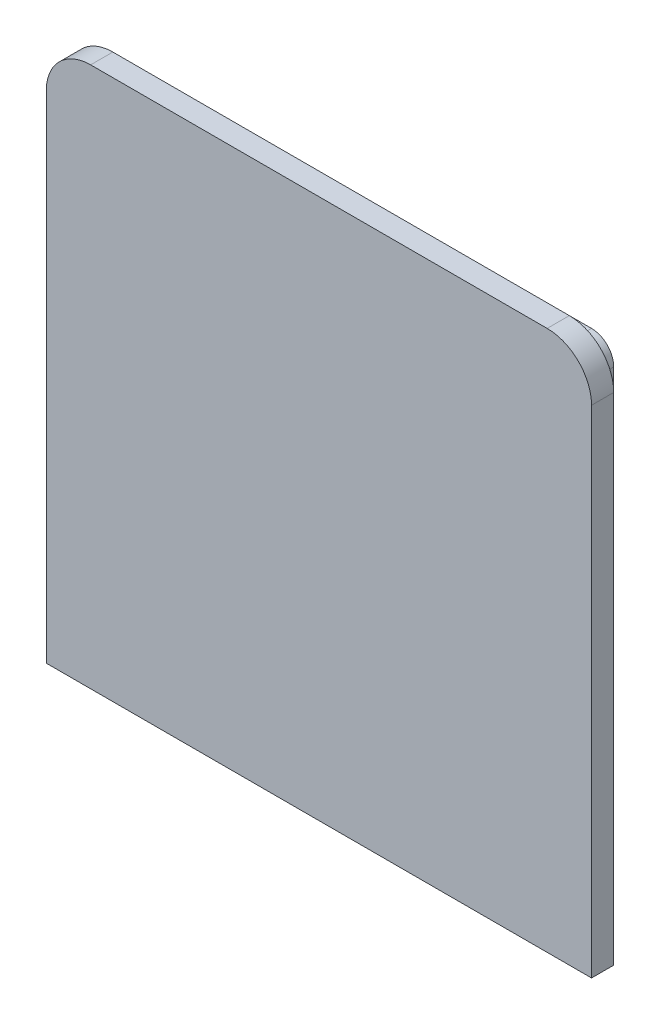
ISO-10303-21;
HEADER;
FILE_DESCRIPTION(('STEP AP214'),'2;1');
FILE_NAME('part.step','',(''),(''),'','','');
FILE_SCHEMA(('AUTOMOTIVE_DESIGN { 1 0 10303 214 1 1 1 1 }'));
ENDSEC;
DATA;
#1=APPLICATION_CONTEXT('core data for automotive mechanical design processes');
#2=APPLICATION_PROTOCOL_DEFINITION('international standard','automotive_design',2000,#1);
#3=PRODUCT_CONTEXT('',#1,'mechanical');
#4=PRODUCT('Part','Part','',(#3));
#5=PRODUCT_RELATED_PRODUCT_CATEGORY('part','',(#4));
#6=PRODUCT_DEFINITION_FORMATION('','',#4);
#7=PRODUCT_DEFINITION_CONTEXT('part definition',#1,'design');
#8=PRODUCT_DEFINITION('design','',#6,#7);
#9=PRODUCT_DEFINITION_SHAPE('','',#8);
#10=(LENGTH_UNIT() NAMED_UNIT(*) SI_UNIT(.MILLI.,.METRE.));
#11=(NAMED_UNIT(*) PLANE_ANGLE_UNIT() SI_UNIT($,.RADIAN.));
#12=(NAMED_UNIT(*) SI_UNIT($,.STERADIAN.) SOLID_ANGLE_UNIT());
#13=UNCERTAINTY_MEASURE_WITH_UNIT(LENGTH_MEASURE(1.E-05),#10,'distance_accuracy_value','');
#14=(GEOMETRIC_REPRESENTATION_CONTEXT(3) GLOBAL_UNCERTAINTY_ASSIGNED_CONTEXT((#13)) GLOBAL_UNIT_ASSIGNED_CONTEXT((#10,
#11,#12)) REPRESENTATION_CONTEXT('',''));
#15=CARTESIAN_POINT('',(0.,0.,0.));
#16=DIRECTION('',(0.,0.,1.));
#17=DIRECTION('',(1.,0.,0.));
#18=AXIS2_PLACEMENT_3D('',#15,#16,#17);
#19=CARTESIAN_POINT('',(17.8633729019827,80.3220364003978,-1.));
#20=DIRECTION('',(1.,0.,0.));
#21=DIRECTION('',(0.,0.,-1.));
#22=AXIS2_PLACEMENT_3D('',#19,#20,#21);
#23=PLANE('',#22);
#24=DIRECTION('',(0.,1.,0.));
#25=VECTOR('',#24,1.);
#26=CARTESIAN_POINT('',(17.8633729019827,80.3220364003978,0.));
#27=LINE('',#26,#25);
#28=CARTESIAN_POINT('',(17.8633729019827,80.3220364003978,0.));
#29=VERTEX_POINT('',#28);
#30=CARTESIAN_POINT('',(17.8633729019827,100.681701940786,0.));
#31=VERTEX_POINT('',#30);
#32=EDGE_CURVE('E265',#29,#31,#27,.T.);
#33=ORIENTED_EDGE('',*,*,#32,.F.);
#34=DIRECTION('',(0.,0.,1.));
#35=VECTOR('',#34,1.);
#36=CARTESIAN_POINT('',(17.8633729019827,80.3220364003978,-1.));
#37=LINE('',#36,#35);
#38=CARTESIAN_POINT('',(17.8633729019827,80.3220364003978,-1.));
#39=VERTEX_POINT('',#38);
#40=EDGE_CURVE('E12',#29,#39,#37,.F.);
#41=ORIENTED_EDGE('',*,*,#40,.T.);
#42=DIRECTION('',(0.,1.,0.));
#43=VECTOR('',#42,1.);
#44=CARTESIAN_POINT('',(17.8633729019827,80.3220364003978,-1.));
#45=LINE('',#44,#43);
#46=CARTESIAN_POINT('',(17.8633729019827,100.681701940786,-1.));
#47=VERTEX_POINT('',#46);
#48=EDGE_CURVE('E274',#39,#47,#45,.T.);
#49=ORIENTED_EDGE('',*,*,#48,.T.);
#50=DIRECTION('',(0.,0.,1.));
#51=VECTOR('',#50,1.);
#52=CARTESIAN_POINT('',(17.8633729019827,100.681701940786,-1.));
#53=LINE('',#52,#51);
#54=EDGE_CURVE('E89',#47,#31,#53,.T.);
#55=ORIENTED_EDGE('',*,*,#54,.T.);
#56=EDGE_LOOP('',(#33,#41,#49,#55));
#57=FACE_BOUND('',#56,.T.);
#58=ADVANCED_FACE('F81',(#57),#23,.T.);
#59=CARTESIAN_POINT('',(11.573708355002,79.3220364003978,-1.));
#60=DIRECTION('',(0.,-1.,0.));
#61=DIRECTION('',(0.,0.,-1.));
#62=AXIS2_PLACEMENT_3D('',#59,#60,#61);
#63=PLANE('',#62);
#64=DIRECTION('',(1.,0.,0.));
#65=VECTOR('',#64,1.);
#66=CARTESIAN_POINT('',(-3.71595619197894,79.3220364003978,-1.));
#67=LINE('',#66,#65);
#68=CARTESIAN_POINT('',(-3.71595619197894,79.3220364003978,-1.));
#69=VERTEX_POINT('',#68);
#70=CARTESIAN_POINT('',(16.8633729019827,79.3220364003978,-1.));
#71=VERTEX_POINT('',#70);
#72=EDGE_CURVE('E284',#69,#71,#67,.T.);
#73=ORIENTED_EDGE('',*,*,#72,.T.);
#74=DIRECTION('',(0.,0.,1.));
#75=VECTOR('',#74,1.);
#76=CARTESIAN_POINT('',(16.8633729019827,79.3220364003978,-1.));
#77=LINE('',#76,#75);
#78=CARTESIAN_POINT('',(16.8633729019827,79.3220364003978,0.));
#79=VERTEX_POINT('',#78);
#80=EDGE_CURVE('E326',#71,#79,#77,.T.);
#81=ORIENTED_EDGE('',*,*,#80,.T.);
#82=DIRECTION('',(1.,0.,0.));
#83=VECTOR('',#82,1.);
#84=CARTESIAN_POINT('',(11.573708355002,79.3220364003978,0.));
#85=LINE('',#84,#83);
#86=CARTESIAN_POINT('',(-3.71595619197894,79.3220364003978,0.));
#87=VERTEX_POINT('',#86);
#88=EDGE_CURVE('E278',#87,#79,#85,.T.);
#89=ORIENTED_EDGE('',*,*,#88,.F.);
#90=DIRECTION('',(0.,0.,1.));
#91=VECTOR('',#90,1.);
#92=CARTESIAN_POINT('',(-3.71595619197894,79.3220364003978,-1.));
#93=LINE('',#92,#91);
#94=EDGE_CURVE('E103',#87,#69,#93,.F.);
#95=ORIENTED_EDGE('',*,*,#94,.T.);
#96=EDGE_LOOP('',(#73,#81,#89,#95));
#97=FACE_BOUND('',#96,.T.);
#98=ADVANCED_FACE('F340',(#97),#63,.T.);
#99=CARTESIAN_POINT('',(-4.71595619197894,100.681701940786,-1.));
#100=DIRECTION('',(-1.,0.,0.));
#101=DIRECTION('',(0.,-1.,0.));
#102=AXIS2_PLACEMENT_3D('',#99,#100,#101);
#103=PLANE('',#102);
#104=DIRECTION('',(0.,-1.,0.));
#105=VECTOR('',#104,1.);
#106=CARTESIAN_POINT('',(-4.71595619197894,100.681701940786,0.));
#107=LINE('',#106,#105);
#108=CARTESIAN_POINT('',(-4.71595619197894,100.681701940786,0.));
#109=VERTEX_POINT('',#108);
#110=CARTESIAN_POINT('',(-4.71595619197894,80.3220364003978,0.));
#111=VERTEX_POINT('',#110);
#112=EDGE_CURVE('E292',#109,#111,#107,.T.);
#113=ORIENTED_EDGE('',*,*,#112,.F.);
#114=DIRECTION('',(0.,0.,1.));
#115=VECTOR('',#114,1.);
#116=CARTESIAN_POINT('',(-4.71595619197894,100.681701940786,-1.));
#117=LINE('',#116,#115);
#118=CARTESIAN_POINT('',(-4.71595619197894,100.681701940786,-1.));
#119=VERTEX_POINT('',#118);
#120=EDGE_CURVE('E316',#109,#119,#117,.F.);
#121=ORIENTED_EDGE('',*,*,#120,.T.);
#122=DIRECTION('',(0.,-1.,0.));
#123=VECTOR('',#122,1.);
#124=CARTESIAN_POINT('',(-4.71595619197894,100.681701940786,-1.));
#125=LINE('',#124,#123);
#126=CARTESIAN_POINT('',(-4.71595619197894,80.3220364003978,-1.));
#127=VERTEX_POINT('',#126);
#128=EDGE_CURVE('E281',#119,#127,#125,.T.);
#129=ORIENTED_EDGE('',*,*,#128,.T.);
#130=DIRECTION('',(0.,0.,1.));
#131=VECTOR('',#130,1.);
#132=CARTESIAN_POINT('',(-4.71595619197894,80.3220364003978,-1.));
#133=LINE('',#132,#131);
#134=EDGE_CURVE('E313',#127,#111,#133,.T.);
#135=ORIENTED_EDGE('',*,*,#134,.T.);
#136=EDGE_LOOP('',(#113,#121,#129,#135));
#137=FACE_BOUND('',#136,.T.);
#138=ADVANCED_FACE('F347',(#137),#103,.T.);
#139=CARTESIAN_POINT('',(1.58812117407224,101.681701940786,-1.));
#140=DIRECTION('',(0.,1.,0.));
#141=DIRECTION('',(0.,0.,1.));
#142=AXIS2_PLACEMENT_3D('',#139,#140,#141);
#143=PLANE('',#142);
#144=DIRECTION('',(-1.,0.,0.));
#145=VECTOR('',#144,1.);
#146=CARTESIAN_POINT('',(16.8633729019827,101.681701940786,-1.));
#147=LINE('',#146,#145);
#148=CARTESIAN_POINT('',(16.8633729019827,101.681701940786,-1.));
#149=VERTEX_POINT('',#148);
#150=CARTESIAN_POINT('',(-3.71595619197894,101.681701940786,-1.));
#151=VERTEX_POINT('',#150);
#152=EDGE_CURVE('E277',#149,#151,#147,.T.);
#153=ORIENTED_EDGE('',*,*,#152,.T.);
#154=DIRECTION('',(0.,0.,1.));
#155=VECTOR('',#154,1.);
#156=CARTESIAN_POINT('',(-3.71595619197894,101.681701940786,-1.));
#157=LINE('',#156,#155);
#158=CARTESIAN_POINT('',(-3.71595619197894,101.681701940786,0.));
#159=VERTEX_POINT('',#158);
#160=EDGE_CURVE('E298',#151,#159,#157,.T.);
#161=ORIENTED_EDGE('',*,*,#160,.T.);
#162=DIRECTION('',(-1.,0.,0.));
#163=VECTOR('',#162,1.);
#164=CARTESIAN_POINT('',(1.58812117407224,101.681701940786,0.));
#165=LINE('',#164,#163);
#166=CARTESIAN_POINT('',(16.8633729019827,101.681701940786,0.));
#167=VERTEX_POINT('',#166);
#168=EDGE_CURVE('E289',#167,#159,#165,.T.);
#169=ORIENTED_EDGE('',*,*,#168,.F.);
#170=DIRECTION('',(0.,0.,1.));
#171=VECTOR('',#170,1.);
#172=CARTESIAN_POINT('',(16.8633729019827,101.681701940786,-1.));
#173=LINE('',#172,#171);
#174=EDGE_CURVE('E286',#167,#149,#173,.F.);
#175=ORIENTED_EDGE('',*,*,#174,.T.);
#176=EDGE_LOOP('',(#153,#161,#169,#175));
#177=FACE_BOUND('',#176,.T.);
#178=ADVANCED_FACE('F355',(#177),#143,.T.);
#179=CARTESIAN_POINT('',(0.,0.,-1.));
#180=DIRECTION('',(0.,0.,1.));
#181=DIRECTION('',(1.,0.,0.));
#182=AXIS2_PLACEMENT_3D('',#179,#180,#181);
#183=PLANE('',#182);
#184=DIRECTION('',(1.,0.,0.));
#185=VECTOR('',#184,1.);
#186=CARTESIAN_POINT('',(-3.71595619197894,80.3220364003978,-1.));
#187=LINE('',#186,#185);
#188=CARTESIAN_POINT('',(-3.71595619197894,80.3220364003978,-1.));
#189=VERTEX_POINT('',#188);
#190=CARTESIAN_POINT('',(16.8633729019827,80.3220364003978,-1.));
#191=VERTEX_POINT('',#190);
#192=EDGE_CURVE('E251',#189,#191,#187,.T.);
#193=ORIENTED_EDGE('',*,*,#192,.T.);
#194=DIRECTION('',(0.,1.,0.));
#195=VECTOR('',#194,1.);
#196=CARTESIAN_POINT('',(16.8633729019827,80.3220364003978,-1.));
#197=LINE('',#196,#195);
#198=CARTESIAN_POINT('',(16.8633729019827,100.681701940786,-1.));
#199=VERTEX_POINT('',#198);
#200=EDGE_CURVE('E241',#191,#199,#197,.T.);
#201=ORIENTED_EDGE('',*,*,#200,.T.);
#202=DIRECTION('',(-1.,0.,0.));
#203=VECTOR('',#202,1.);
#204=CARTESIAN_POINT('',(16.8633729019827,100.681701940786,-1.));
#205=LINE('',#204,#203);
#206=CARTESIAN_POINT('',(-3.71595619197894,100.681701940786,-1.));
#207=VERTEX_POINT('',#206);
#208=EDGE_CURVE('E244',#199,#207,#205,.T.);
#209=ORIENTED_EDGE('',*,*,#208,.T.);
#210=DIRECTION('',(0.,-1.,0.));
#211=VECTOR('',#210,1.);
#212=CARTESIAN_POINT('',(-3.71595619197894,100.681701940786,-1.));
#213=LINE('',#212,#211);
#214=EDGE_CURVE('E248',#207,#189,#213,.T.);
#215=ORIENTED_EDGE('',*,*,#214,.T.);
#216=EDGE_LOOP('',(#193,#201,#209,#215));
#217=FACE_BOUND('',#216,.T.);
#218=ORIENTED_EDGE('',*,*,#128,.F.);
#219=CARTESIAN_POINT('',(-3.71595619197894,100.681701940786,-1.));
#220=DIRECTION('',(0.,0.,1.));
#221=DIRECTION('',(1.,0.,0.));
#222=AXIS2_PLACEMENT_3D('',#219,#220,#221);
#223=CIRCLE('',#222,1.);
#224=EDGE_CURVE('E323',#119,#151,#223,.F.);
#225=ORIENTED_EDGE('',*,*,#224,.T.);
#226=ORIENTED_EDGE('',*,*,#152,.F.);
#227=CARTESIAN_POINT('',(16.8633729019827,100.681701940786,-1.));
#228=DIRECTION('',(0.,0.,1.));
#229=DIRECTION('',(1.,0.,0.));
#230=AXIS2_PLACEMENT_3D('',#227,#228,#229);
#231=CIRCLE('',#230,1.);
#232=EDGE_CURVE('E320',#149,#47,#231,.F.);
#233=ORIENTED_EDGE('',*,*,#232,.T.);
#234=ORIENTED_EDGE('',*,*,#48,.F.);
#235=CARTESIAN_POINT('',(16.8633729019827,80.3220364003978,-1.));
#236=DIRECTION('',(0.,0.,1.));
#237=DIRECTION('',(1.,0.,0.));
#238=AXIS2_PLACEMENT_3D('',#235,#236,#237);
#239=CIRCLE('',#238,1.);
#240=EDGE_CURVE('E96',#39,#71,#239,.F.);
#241=ORIENTED_EDGE('',*,*,#240,.T.);
#242=ORIENTED_EDGE('',*,*,#72,.F.);
#243=CARTESIAN_POINT('',(-3.71595619197894,80.3220364003978,-1.));
#244=DIRECTION('',(0.,0.,1.));
#245=DIRECTION('',(1.,0.,0.));
#246=AXIS2_PLACEMENT_3D('',#243,#244,#245);
#247=CIRCLE('',#246,1.);
#248=EDGE_CURVE('E318',#69,#127,#247,.F.);
#249=ORIENTED_EDGE('',*,*,#248,.T.);
#250=EDGE_LOOP('',(#218,#225,#226,#233,#234,#241,#242,#249));
#251=FACE_BOUND('',#250,.T.);
#252=ADVANCED_FACE('F343',(#217,#251),#183,.F.);
#253=CARTESIAN_POINT('',(16.8633729019827,80.3220364003978,-1.));
#254=DIRECTION('',(1.,0.,0.));
#255=DIRECTION('',(0.,0.,-1.));
#256=AXIS2_PLACEMENT_3D('',#253,#254,#255);
#257=PLANE('',#256);
#258=DIRECTION('',(0.,1.,0.));
#259=VECTOR('',#258,1.);
#260=CARTESIAN_POINT('',(16.8633729019827,80.3220364003978,0.));
#261=LINE('',#260,#259);
#262=CARTESIAN_POINT('',(16.8633729019827,80.3220364003978,0.));
#263=VERTEX_POINT('',#262);
#264=CARTESIAN_POINT('',(16.8633729019827,100.681701940786,0.));
#265=VERTEX_POINT('',#264);
#266=EDGE_CURVE('E232',#263,#265,#261,.T.);
#267=ORIENTED_EDGE('',*,*,#266,.T.);
#268=DIRECTION('',(0.,0.,1.));
#269=VECTOR('',#268,1.);
#270=CARTESIAN_POINT('',(16.8633729019827,100.681701940786,-1.));
#271=LINE('',#270,#269);
#272=EDGE_CURVE('E253',#199,#265,#271,.T.);
#273=ORIENTED_EDGE('',*,*,#272,.F.);
#274=ORIENTED_EDGE('',*,*,#200,.F.);
#275=DIRECTION('',(0.,0.,1.));
#276=VECTOR('',#275,1.);
#277=CARTESIAN_POINT('',(16.8633729019827,80.3220364003978,-1.));
#278=LINE('',#277,#276);
#279=EDGE_CURVE('E262',#191,#263,#278,.T.);
#280=ORIENTED_EDGE('',*,*,#279,.T.);
#281=EDGE_LOOP('',(#267,#273,#274,#280));
#282=FACE_BOUND('',#281,.T.);
#283=ADVANCED_FACE('F389',(#282),#257,.F.);
#284=CARTESIAN_POINT('',(11.573708355002,80.3220364003978,-1.));
#285=DIRECTION('',(0.,-1.,0.));
#286=DIRECTION('',(0.,0.,-1.));
#287=AXIS2_PLACEMENT_3D('',#284,#285,#286);
#288=PLANE('',#287);
#289=DIRECTION('',(1.,0.,0.));
#290=VECTOR('',#289,1.);
#291=CARTESIAN_POINT('',(11.573708355002,80.3220364003978,0.));
#292=LINE('',#291,#290);
#293=CARTESIAN_POINT('',(-3.71595619197894,80.3220364003978,0.));
#294=VERTEX_POINT('',#293);
#295=EDGE_CURVE('E245',#294,#263,#292,.T.);
#296=ORIENTED_EDGE('',*,*,#295,.T.);
#297=ORIENTED_EDGE('',*,*,#279,.F.);
#298=ORIENTED_EDGE('',*,*,#192,.F.);
#299=DIRECTION('',(0.,0.,1.));
#300=VECTOR('',#299,1.);
#301=CARTESIAN_POINT('',(-3.71595619197894,80.3220364003978,-1.));
#302=LINE('',#301,#300);
#303=EDGE_CURVE('E266',#189,#294,#302,.T.);
#304=ORIENTED_EDGE('',*,*,#303,.T.);
#305=EDGE_LOOP('',(#296,#297,#298,#304));
#306=FACE_BOUND('',#305,.T.);
#307=ADVANCED_FACE('F384',(#306),#288,.F.);
#308=CARTESIAN_POINT('',(-3.71595619197894,100.681701940786,-1.));
#309=DIRECTION('',(-1.,0.,0.));
#310=DIRECTION('',(0.,-1.,0.));
#311=AXIS2_PLACEMENT_3D('',#308,#309,#310);
#312=PLANE('',#311);
#313=DIRECTION('',(0.,-1.,0.));
#314=VECTOR('',#313,1.);
#315=CARTESIAN_POINT('',(-3.71595619197894,100.681701940786,0.));
#316=LINE('',#315,#314);
#317=CARTESIAN_POINT('',(-3.71595619197894,100.681701940786,0.));
#318=VERTEX_POINT('',#317);
#319=EDGE_CURVE('E257',#318,#294,#316,.T.);
#320=ORIENTED_EDGE('',*,*,#319,.T.);
#321=ORIENTED_EDGE('',*,*,#303,.F.);
#322=ORIENTED_EDGE('',*,*,#214,.F.);
#323=DIRECTION('',(0.,0.,1.));
#324=VECTOR('',#323,1.);
#325=CARTESIAN_POINT('',(-3.71595619197894,100.681701940786,-1.));
#326=LINE('',#325,#324);
#327=EDGE_CURVE('E269',#207,#318,#326,.T.);
#328=ORIENTED_EDGE('',*,*,#327,.T.);
#329=EDGE_LOOP('',(#320,#321,#322,#328));
#330=FACE_BOUND('',#329,.T.);
#331=ADVANCED_FACE('F378',(#330),#312,.F.);
#332=CARTESIAN_POINT('',(1.58812117407224,100.681701940786,-1.));
#333=DIRECTION('',(0.,1.,0.));
#334=DIRECTION('',(0.,0.,1.));
#335=AXIS2_PLACEMENT_3D('',#332,#333,#334);
#336=PLANE('',#335);
#337=DIRECTION('',(-1.,0.,0.));
#338=VECTOR('',#337,1.);
#339=CARTESIAN_POINT('',(1.58812117407224,100.681701940786,0.));
#340=LINE('',#339,#338);
#341=EDGE_CURVE('E235',#265,#318,#340,.T.);
#342=ORIENTED_EDGE('',*,*,#341,.T.);
#343=ORIENTED_EDGE('',*,*,#327,.F.);
#344=ORIENTED_EDGE('',*,*,#208,.F.);
#345=ORIENTED_EDGE('',*,*,#272,.T.);
#346=EDGE_LOOP('',(#342,#343,#344,#345));
#347=FACE_BOUND('',#346,.T.);
#348=ADVANCED_FACE('F374',(#347),#336,.F.);
#349=CARTESIAN_POINT('',(-3.71595619197894,100.681701940786,-1.));
#350=DIRECTION('',(0.,0.,1.));
#351=DIRECTION('',(1.,0.,0.));
#352=AXIS2_PLACEMENT_3D('',#349,#350,#351);
#353=CYLINDRICAL_SURFACE('',#352,1.);
#354=ORIENTED_EDGE('',*,*,#224,.F.);
#355=ORIENTED_EDGE('',*,*,#120,.F.);
#356=CARTESIAN_POINT('',(-3.71595619197894,100.681701940786,0.));
#357=DIRECTION('',(0.,0.,1.));
#358=DIRECTION('',(1.,0.,0.));
#359=AXIS2_PLACEMENT_3D('',#356,#357,#358);
#360=CIRCLE('',#359,1.);
#361=EDGE_CURVE('E310',#159,#109,#360,.T.);
#362=ORIENTED_EDGE('',*,*,#361,.F.);
#363=ORIENTED_EDGE('',*,*,#160,.F.);
#364=EDGE_LOOP('',(#354,#355,#362,#363));
#365=FACE_BOUND('',#364,.T.);
#366=ADVANCED_FACE('F353',(#365),#353,.T.);
#367=CARTESIAN_POINT('',(16.8633729019827,80.3220364003978,-1.));
#368=DIRECTION('',(0.,0.,1.));
#369=DIRECTION('',(1.,0.,0.));
#370=AXIS2_PLACEMENT_3D('',#367,#368,#369);
#371=CYLINDRICAL_SURFACE('',#370,1.);
#372=ORIENTED_EDGE('',*,*,#240,.F.);
#373=ORIENTED_EDGE('',*,*,#40,.F.);
#374=CARTESIAN_POINT('',(16.8633729019827,80.3220364003978,0.));
#375=DIRECTION('',(0.,0.,1.));
#376=DIRECTION('',(1.,0.,0.));
#377=AXIS2_PLACEMENT_3D('',#374,#375,#376);
#378=CIRCLE('',#377,1.);
#379=EDGE_CURVE('E307',#79,#29,#378,.T.);
#380=ORIENTED_EDGE('',*,*,#379,.F.);
#381=ORIENTED_EDGE('',*,*,#80,.F.);
#382=EDGE_LOOP('',(#372,#373,#380,#381));
#383=FACE_BOUND('',#382,.T.);
#384=ADVANCED_FACE('F339',(#383),#371,.T.);
#385=CARTESIAN_POINT('',(16.8633729019827,100.681701940786,-1.));
#386=DIRECTION('',(0.,0.,1.));
#387=DIRECTION('',(1.,0.,0.));
#388=AXIS2_PLACEMENT_3D('',#385,#386,#387);
#389=CYLINDRICAL_SURFACE('',#388,1.);
#390=ORIENTED_EDGE('',*,*,#232,.F.);
#391=ORIENTED_EDGE('',*,*,#174,.F.);
#392=CARTESIAN_POINT('',(16.8633729019827,100.681701940786,0.));
#393=DIRECTION('',(0.,0.,1.));
#394=DIRECTION('',(1.,0.,0.));
#395=AXIS2_PLACEMENT_3D('',#392,#393,#394);
#396=CIRCLE('',#395,1.);
#397=EDGE_CURVE('E304',#31,#167,#396,.T.);
#398=ORIENTED_EDGE('',*,*,#397,.F.);
#399=ORIENTED_EDGE('',*,*,#54,.F.);
#400=EDGE_LOOP('',(#390,#391,#398,#399));
#401=FACE_BOUND('',#400,.T.);
#402=ADVANCED_FACE('F357',(#401),#389,.T.);
#403=CARTESIAN_POINT('',(-3.71595619197894,80.3220364003978,-1.));
#404=DIRECTION('',(0.,0.,1.));
#405=DIRECTION('',(1.,0.,0.));
#406=AXIS2_PLACEMENT_3D('',#403,#404,#405);
#407=CYLINDRICAL_SURFACE('',#406,1.);
#408=ORIENTED_EDGE('',*,*,#248,.F.);
#409=ORIENTED_EDGE('',*,*,#94,.F.);
#410=CARTESIAN_POINT('',(-3.71595619197894,80.3220364003978,0.));
#411=DIRECTION('',(0.,0.,1.));
#412=DIRECTION('',(1.,0.,0.));
#413=AXIS2_PLACEMENT_3D('',#410,#411,#412);
#414=CIRCLE('',#413,1.);
#415=EDGE_CURVE('E301',#111,#87,#414,.T.);
#416=ORIENTED_EDGE('',*,*,#415,.F.);
#417=ORIENTED_EDGE('',*,*,#134,.F.);
#418=EDGE_LOOP('',(#408,#409,#416,#417));
#419=FACE_BOUND('',#418,.T.);
#420=ADVANCED_FACE('F83',(#419),#407,.T.);
#421=CARTESIAN_POINT('',(-3.71595619197894,100.681701940786,0.));
#422=DIRECTION('',(0.,0.,1.));
#423=DIRECTION('',(1.,0.,0.));
#424=AXIS2_PLACEMENT_3D('',#421,#422,#423);
#425=PLANE('',#424);
#426=ORIENTED_EDGE('',*,*,#397,.T.);
#427=ORIENTED_EDGE('',*,*,#168,.T.);
#428=ORIENTED_EDGE('',*,*,#361,.T.);
#429=ORIENTED_EDGE('',*,*,#112,.T.);
#430=ORIENTED_EDGE('',*,*,#415,.T.);
#431=ORIENTED_EDGE('',*,*,#88,.T.);
#432=ORIENTED_EDGE('',*,*,#379,.T.);
#433=ORIENTED_EDGE('',*,*,#32,.T.);
#434=EDGE_LOOP('',(#426,#427,#428,#429,#430,#431,#432,#433));
#435=FACE_BOUND('',#434,.T.);
#436=CARTESIAN_POINT('',(-3.71595619197894,100.681701940786,0.));
#437=DIRECTION('',(0.,0.,1.));
#438=DIRECTION('',(1.,0.,0.));
#439=AXIS2_PLACEMENT_3D('',#436,#437,#438);
#440=CIRCLE('',#439,2.);
#441=CARTESIAN_POINT('',(-3.71595619197894,102.681701940786,0.));
#442=VERTEX_POINT('',#441);
#443=CARTESIAN_POINT('',(-5.71595619197894,100.681701940786,0.));
#444=VERTEX_POINT('',#443);
#445=EDGE_CURVE('E231',#442,#444,#440,.T.);
#446=ORIENTED_EDGE('',*,*,#445,.F.);
#447=DIRECTION('',(-1.,0.,0.));
#448=VECTOR('',#447,1.);
#449=CARTESIAN_POINT('',(1.58812117407224,102.681701940786,0.));
#450=LINE('',#449,#448);
#451=CARTESIAN_POINT('',(16.8633729019827,102.681701940786,0.));
#452=VERTEX_POINT('',#451);
#453=EDGE_CURVE('E227',#452,#442,#450,.T.);
#454=ORIENTED_EDGE('',*,*,#453,.F.);
#455=CARTESIAN_POINT('',(16.8633729019827,100.681701940786,0.));
#456=DIRECTION('',(0.,0.,1.));
#457=DIRECTION('',(1.,0.,0.));
#458=AXIS2_PLACEMENT_3D('',#455,#456,#457);
#459=CIRCLE('',#458,2.);
#460=CARTESIAN_POINT('',(18.8633729019827,100.681701940786,0.));
#461=VERTEX_POINT('',#460);
#462=EDGE_CURVE('E556',#461,#452,#459,.T.);
#463=ORIENTED_EDGE('',*,*,#462,.F.);
#464=DIRECTION('',(0.,1.,0.));
#465=VECTOR('',#464,1.);
#466=CARTESIAN_POINT('',(18.8633729019827,78.3220364003978,0.));
#467=LINE('',#466,#465);
#468=CARTESIAN_POINT('',(18.8633729019827,78.3220364003978,0.));
#469=VERTEX_POINT('',#468);
#470=EDGE_CURVE('E547',#469,#461,#467,.T.);
#471=ORIENTED_EDGE('',*,*,#470,.F.);
#472=DIRECTION('',(1.,0.,0.));
#473=VECTOR('',#472,1.);
#474=CARTESIAN_POINT('',(11.573708355002,78.3220364003978,0.));
#475=LINE('',#474,#473);
#476=CARTESIAN_POINT('',(-5.71595619197894,78.3220364003978,0.));
#477=VERTEX_POINT('',#476);
#478=EDGE_CURVE('E543',#477,#469,#475,.T.);
#479=ORIENTED_EDGE('',*,*,#478,.F.);
#480=DIRECTION('',(0.,-1.,0.));
#481=VECTOR('',#480,1.);
#482=CARTESIAN_POINT('',(-5.71595619197894,100.681701940786,0.));
#483=LINE('',#482,#481);
#484=EDGE_CURVE('E548',#444,#477,#483,.T.);
#485=ORIENTED_EDGE('',*,*,#484,.F.);
#486=EDGE_LOOP('',(#446,#454,#463,#471,#479,#485));
#487=FACE_BOUND('',#486,.T.);
#488=ADVANCED_FACE('F335',(#435,#487),#425,.F.);
#489=CARTESIAN_POINT('',(-3.71595619197894,100.681701940786,1.));
#490=DIRECTION('',(0.,0.,1.));
#491=DIRECTION('',(1.,0.,0.));
#492=AXIS2_PLACEMENT_3D('',#489,#490,#491);
#493=PLANE('',#492);
#494=CARTESIAN_POINT('',(-3.71595619197894,100.681701940786,1.));
#495=DIRECTION('',(0.,0.,1.));
#496=DIRECTION('',(1.,0.,0.));
#497=AXIS2_PLACEMENT_3D('',#494,#495,#496);
#498=CIRCLE('',#497,2.);
#499=CARTESIAN_POINT('',(-3.71595619197894,102.681701940786,1.));
#500=VERTEX_POINT('',#499);
#501=CARTESIAN_POINT('',(-5.71595619197894,100.681701940786,1.));
#502=VERTEX_POINT('',#501);
#503=EDGE_CURVE('E218',#500,#502,#498,.T.);
#504=ORIENTED_EDGE('',*,*,#503,.T.);
#505=DIRECTION('',(0.,-1.,0.));
#506=VECTOR('',#505,1.);
#507=CARTESIAN_POINT('',(-5.71595619197894,100.681701940786,1.));
#508=LINE('',#507,#506);
#509=CARTESIAN_POINT('',(-5.71595619197894,78.3220364003978,1.));
#510=VERTEX_POINT('',#509);
#511=EDGE_CURVE('E206',#502,#510,#508,.T.);
#512=ORIENTED_EDGE('',*,*,#511,.T.);
#513=DIRECTION('',(1.,0.,0.));
#514=VECTOR('',#513,1.);
#515=CARTESIAN_POINT('',(-5.71595619197894,78.3220364003978,1.));
#516=LINE('',#515,#514);
#517=CARTESIAN_POINT('',(18.8633729019827,78.3220364003978,1.));
#518=VERTEX_POINT('',#517);
#519=EDGE_CURVE('E217',#510,#518,#516,.T.);
#520=ORIENTED_EDGE('',*,*,#519,.T.);
#521=DIRECTION('',(0.,1.,0.));
#522=VECTOR('',#521,1.);
#523=CARTESIAN_POINT('',(18.8633729019827,78.3220364003978,1.));
#524=LINE('',#523,#522);
#525=CARTESIAN_POINT('',(18.8633729019827,100.681701940786,1.));
#526=VERTEX_POINT('',#525);
#527=EDGE_CURVE('E552',#518,#526,#524,.T.);
#528=ORIENTED_EDGE('',*,*,#527,.T.);
#529=CARTESIAN_POINT('',(16.8633729019827,100.681701940786,1.));
#530=DIRECTION('',(0.,0.,1.));
#531=DIRECTION('',(1.,0.,0.));
#532=AXIS2_PLACEMENT_3D('',#529,#530,#531);
#533=CIRCLE('',#532,2.);
#534=CARTESIAN_POINT('',(16.8633729019827,102.681701940786,1.));
#535=VERTEX_POINT('',#534);
#536=EDGE_CURVE('E569',#526,#535,#533,.T.);
#537=ORIENTED_EDGE('',*,*,#536,.T.);
#538=DIRECTION('',(-1.,0.,0.));
#539=VECTOR('',#538,1.);
#540=CARTESIAN_POINT('',(16.8633729019827,102.681701940786,1.));
#541=LINE('',#540,#539);
#542=EDGE_CURVE('E223',#535,#500,#541,.T.);
#543=ORIENTED_EDGE('',*,*,#542,.T.);
#544=EDGE_LOOP('',(#504,#512,#520,#528,#537,#543));
#545=FACE_BOUND('',#544,.T.);
#546=ADVANCED_FACE('F221',(#545),#493,.T.);
#547=CARTESIAN_POINT('',(1.58812117407224,102.681701940786,1.));
#548=DIRECTION('',(0.,-1.,0.));
#549=DIRECTION('',(0.,0.,-1.));
#550=AXIS2_PLACEMENT_3D('',#547,#548,#549);
#551=PLANE('',#550);
#552=ORIENTED_EDGE('',*,*,#453,.T.);
#553=DIRECTION('',(0.,0.,-1.));
#554=VECTOR('',#553,1.);
#555=CARTESIAN_POINT('',(-3.71595619197894,102.681701940786,1.));
#556=LINE('',#555,#554);
#557=EDGE_CURVE('E562',#500,#442,#556,.T.);
#558=ORIENTED_EDGE('',*,*,#557,.F.);
#559=ORIENTED_EDGE('',*,*,#542,.F.);
#560=DIRECTION('',(0.,0.,-1.));
#561=VECTOR('',#560,1.);
#562=CARTESIAN_POINT('',(16.8633729019827,102.681701940786,1.));
#563=LINE('',#562,#561);
#564=EDGE_CURVE('E564',#535,#452,#563,.T.);
#565=ORIENTED_EDGE('',*,*,#564,.T.);
#566=EDGE_LOOP('',(#552,#558,#559,#565));
#567=FACE_BOUND('',#566,.T.);
#568=ADVANCED_FACE('F463',(#567),#551,.F.);
#569=CARTESIAN_POINT('',(16.8633729019827,100.681701940786,1.));
#570=DIRECTION('',(0.,0.,-1.));
#571=DIRECTION('',(-1.,0.,0.));
#572=AXIS2_PLACEMENT_3D('',#569,#570,#571);
#573=CYLINDRICAL_SURFACE('',#572,2.);
#574=ORIENTED_EDGE('',*,*,#462,.T.);
#575=ORIENTED_EDGE('',*,*,#564,.F.);
#576=ORIENTED_EDGE('',*,*,#536,.F.);
#577=DIRECTION('',(0.,0.,-1.));
#578=VECTOR('',#577,1.);
#579=CARTESIAN_POINT('',(18.8633729019827,100.681701940786,1.));
#580=LINE('',#579,#578);
#581=EDGE_CURVE('E553',#526,#461,#580,.T.);
#582=ORIENTED_EDGE('',*,*,#581,.T.);
#583=EDGE_LOOP('',(#574,#575,#576,#582));
#584=FACE_BOUND('',#583,.T.);
#585=ADVANCED_FACE('F473',(#584),#573,.T.);
#586=CARTESIAN_POINT('',(18.8633729019827,78.3220364003978,1.));
#587=DIRECTION('',(-1.,0.,0.));
#588=DIRECTION('',(0.,-1.,0.));
#589=AXIS2_PLACEMENT_3D('',#586,#587,#588);
#590=PLANE('',#589);
#591=ORIENTED_EDGE('',*,*,#470,.T.);
#592=ORIENTED_EDGE('',*,*,#581,.F.);
#593=ORIENTED_EDGE('',*,*,#527,.F.);
#594=DIRECTION('',(0.,0.,-1.));
#595=VECTOR('',#594,1.);
#596=CARTESIAN_POINT('',(18.8633729019827,78.3220364003978,1.));
#597=LINE('',#596,#595);
#598=EDGE_CURVE('E237',#518,#469,#597,.T.);
#599=ORIENTED_EDGE('',*,*,#598,.T.);
#600=EDGE_LOOP('',(#591,#592,#593,#599));
#601=FACE_BOUND('',#600,.T.);
#602=ADVANCED_FACE('F484',(#601),#590,.F.);
#603=CARTESIAN_POINT('',(11.573708355002,78.3220364003978,1.));
#604=DIRECTION('',(0.,1.,0.));
#605=DIRECTION('',(0.,0.,1.));
#606=AXIS2_PLACEMENT_3D('',#603,#604,#605);
#607=PLANE('',#606);
#608=ORIENTED_EDGE('',*,*,#478,.T.);
#609=ORIENTED_EDGE('',*,*,#598,.F.);
#610=ORIENTED_EDGE('',*,*,#519,.F.);
#611=DIRECTION('',(0.,0.,-1.));
#612=VECTOR('',#611,1.);
#613=CARTESIAN_POINT('',(-5.71595619197894,78.3220364003978,1.));
#614=LINE('',#613,#612);
#615=EDGE_CURVE('E214',#510,#477,#614,.T.);
#616=ORIENTED_EDGE('',*,*,#615,.T.);
#617=EDGE_LOOP('',(#608,#609,#610,#616));
#618=FACE_BOUND('',#617,.T.);
#619=ADVANCED_FACE('F494',(#618),#607,.F.);
#620=CARTESIAN_POINT('',(-5.71595619197894,100.681701940786,1.));
#621=DIRECTION('',(1.,0.,0.));
#622=DIRECTION('',(0.,1.,0.));
#623=AXIS2_PLACEMENT_3D('',#620,#621,#622);
#624=PLANE('',#623);
#625=ORIENTED_EDGE('',*,*,#484,.T.);
#626=ORIENTED_EDGE('',*,*,#615,.F.);
#627=ORIENTED_EDGE('',*,*,#511,.F.);
#628=DIRECTION('',(0.,0.,-1.));
#629=VECTOR('',#628,1.);
#630=CARTESIAN_POINT('',(-5.71595619197894,100.681701940786,1.));
#631=LINE('',#630,#629);
#632=EDGE_CURVE('E211',#502,#444,#631,.T.);
#633=ORIENTED_EDGE('',*,*,#632,.T.);
#634=EDGE_LOOP('',(#625,#626,#627,#633));
#635=FACE_BOUND('',#634,.T.);
#636=ADVANCED_FACE('F209',(#635),#624,.F.);
#637=CARTESIAN_POINT('',(-3.71595619197894,100.681701940786,1.));
#638=DIRECTION('',(0.,0.,-1.));
#639=DIRECTION('',(-1.,0.,0.));
#640=AXIS2_PLACEMENT_3D('',#637,#638,#639);
#641=CYLINDRICAL_SURFACE('',#640,2.);
#642=ORIENTED_EDGE('',*,*,#445,.T.);
#643=ORIENTED_EDGE('',*,*,#632,.F.);
#644=ORIENTED_EDGE('',*,*,#503,.F.);
#645=ORIENTED_EDGE('',*,*,#557,.T.);
#646=EDGE_LOOP('',(#642,#643,#644,#645));
#647=FACE_BOUND('',#646,.T.);
#648=ADVANCED_FACE('F229',(#647),#641,.T.);
#649=ORIENTED_EDGE('',*,*,#266,.F.);
#650=ORIENTED_EDGE('',*,*,#295,.F.);
#651=ORIENTED_EDGE('',*,*,#319,.F.);
#652=ORIENTED_EDGE('',*,*,#341,.F.);
#653=EDGE_LOOP('',(#649,#650,#651,#652));
#654=FACE_BOUND('',#653,.T.);
#655=ADVANCED_FACE('F455',(#654),#425,.F.);
#656=CLOSED_SHELL('',(#58,#98,#138,#178,#252,#283,#307,#331,#348,#366,#384,#402,#420,#488,#546,
#568,#585,#602,#619,#636,#648,#655));
#657=MANIFOLD_SOLID_BREP('B2',#656);
#658=ADVANCED_BREP_SHAPE_REPRESENTATION('',(#18,#657),#14);
#659=SHAPE_DEFINITION_REPRESENTATION(#9,#658);
ENDSEC;
END-ISO-10303-21;
